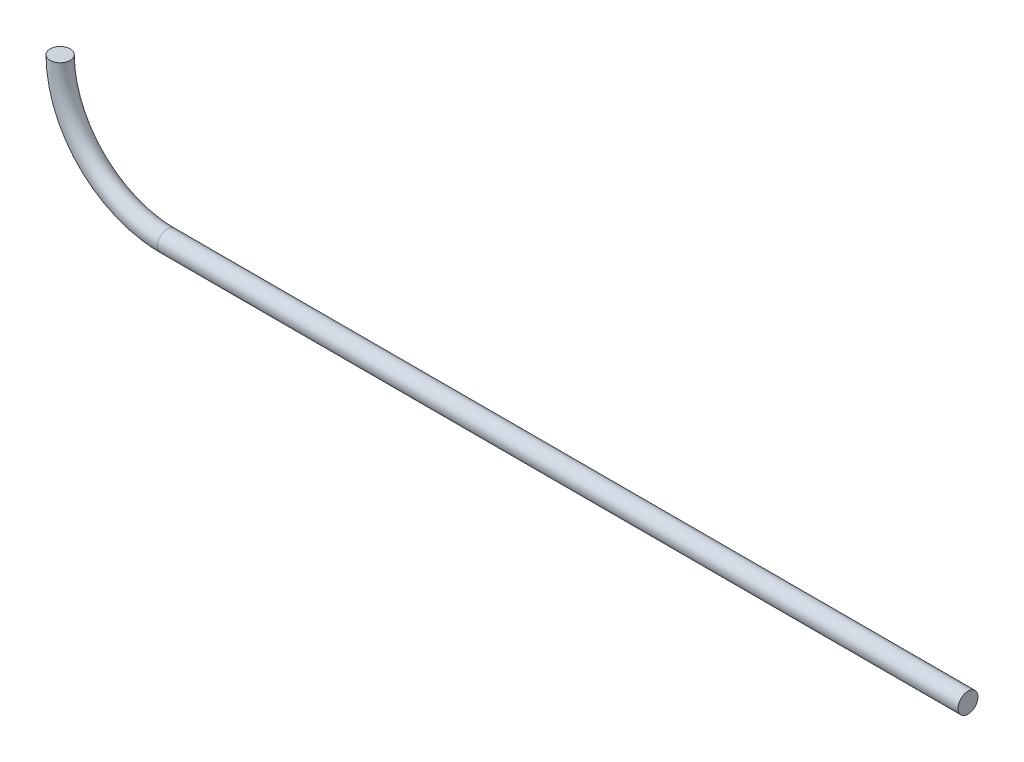
ISO-10303-21;
HEADER;
FILE_DESCRIPTION(('STEP AP214'),'2;1');
FILE_NAME('part.step','',(''),(''),'','','');
FILE_SCHEMA(('AUTOMOTIVE_DESIGN { 1 0 10303 214 1 1 1 1 }'));
ENDSEC;
DATA;
#1=APPLICATION_CONTEXT('core data for automotive mechanical design processes');
#2=APPLICATION_PROTOCOL_DEFINITION('international standard','automotive_design',2000,#1);
#3=PRODUCT_CONTEXT('',#1,'mechanical');
#4=PRODUCT('Part','Part','',(#3));
#5=PRODUCT_RELATED_PRODUCT_CATEGORY('part','',(#4));
#6=PRODUCT_DEFINITION_FORMATION('','',#4);
#7=PRODUCT_DEFINITION_CONTEXT('part definition',#1,'design');
#8=PRODUCT_DEFINITION('design','',#6,#7);
#9=PRODUCT_DEFINITION_SHAPE('','',#8);
#10=(LENGTH_UNIT() NAMED_UNIT(*) SI_UNIT(.MILLI.,.METRE.));
#11=(NAMED_UNIT(*) PLANE_ANGLE_UNIT() SI_UNIT($,.RADIAN.));
#12=(NAMED_UNIT(*) SI_UNIT($,.STERADIAN.) SOLID_ANGLE_UNIT());
#13=UNCERTAINTY_MEASURE_WITH_UNIT(LENGTH_MEASURE(1.E-05),#10,'distance_accuracy_value','');
#14=(GEOMETRIC_REPRESENTATION_CONTEXT(3) GLOBAL_UNCERTAINTY_ASSIGNED_CONTEXT((#13)) GLOBAL_UNIT_ASSIGNED_CONTEXT((#10,
#11,#12)) REPRESENTATION_CONTEXT('',''));
#15=CARTESIAN_POINT('',(0.,0.,0.));
#16=DIRECTION('',(0.,0.,1.));
#17=DIRECTION('',(1.,0.,0.));
#18=AXIS2_PLACEMENT_3D('',#15,#16,#17);
#19=CARTESIAN_POINT('',(-5.36,0.,0.));
#20=DIRECTION('',(0.,1.,0.));
#21=DIRECTION('',(0.,0.,1.));
#22=AXIS2_PLACEMENT_3D('',#19,#20,#21);
#23=PLANE('',#22);
#24=CARTESIAN_POINT('',(-5.36,0.,0.));
#25=DIRECTION('',(0.,1.,0.));
#26=DIRECTION('',(0.,0.,1.));
#27=AXIS2_PLACEMENT_3D('',#24,#25,#26);
#28=CIRCLE('',#27,0.500000000000001);
#29=CARTESIAN_POINT('',(-5.36,0.,0.500000000000001));
#30=VERTEX_POINT('',#29);
#31=EDGE_CURVE('E48',#30,#30,#28,.T.);
#32=ORIENTED_EDGE('',*,*,#31,.T.);
#33=EDGE_LOOP('',(#32));
#34=FACE_BOUND('',#33,.T.);
#35=ADVANCED_FACE('F36',(#34),#23,.T.);
#36=CARTESIAN_POINT('',(40.,-5.36,0.));
#37=DIRECTION('',(-1.,0.,0.));
#38=DIRECTION('',(0.,0.,1.));
#39=AXIS2_PLACEMENT_3D('',#36,#37,#38);
#40=PLANE('',#39);
#41=CARTESIAN_POINT('',(40.,-5.36,0.));
#42=DIRECTION('',(-1.,0.,0.));
#43=DIRECTION('',(0.,0.,1.));
#44=AXIS2_PLACEMENT_3D('',#41,#42,#43);
#45=CIRCLE('',#44,0.500000000000001);
#46=CARTESIAN_POINT('',(40.,-5.36,0.500000000000001));
#47=VERTEX_POINT('',#46);
#48=EDGE_CURVE('E11',#47,#47,#45,.T.);
#49=ORIENTED_EDGE('',*,*,#48,.F.);
#50=EDGE_LOOP('',(#49));
#51=FACE_BOUND('',#50,.T.);
#52=ADVANCED_FACE('F54',(#51),#40,.F.);
#53=CARTESIAN_POINT('',(0.,0.,0.));
#54=DIRECTION('',(0.,0.,1.));
#55=DIRECTION('',(1.,0.,0.));
#56=AXIS2_PLACEMENT_3D('',#53,#54,#55);
#57=TOROIDAL_SURFACE('',#56,5.36,0.500000000000001);
#58=CARTESIAN_POINT('',(0.,-5.36,0.));
#59=DIRECTION('',(-1.,0.,0.));
#60=DIRECTION('',(0.,0.,1.));
#61=AXIS2_PLACEMENT_3D('',#58,#59,#60);
#62=CIRCLE('',#61,0.500000000000001);
#63=CARTESIAN_POINT('',(0.,-5.36,0.500000000000001));
#64=VERTEX_POINT('',#63);
#65=EDGE_CURVE('E43',#64,#64,#62,.T.);
#66=ORIENTED_EDGE('',*,*,#65,.T.);
#67=EDGE_LOOP('',(#66));
#68=FACE_BOUND('',#67,.T.);
#69=ORIENTED_EDGE('',*,*,#31,.F.);
#70=EDGE_LOOP('',(#69));
#71=FACE_BOUND('',#70,.T.);
#72=ADVANCED_FACE('F56',(#68,#71),#57,.T.);
#73=CARTESIAN_POINT('',(0.,-5.36,0.));
#74=DIRECTION('',(1.,0.,0.));
#75=DIRECTION('',(0.,0.,-1.));
#76=AXIS2_PLACEMENT_3D('',#73,#74,#75);
#77=CYLINDRICAL_SURFACE('',#76,0.500000000000001);
#78=ORIENTED_EDGE('',*,*,#48,.T.);
#79=EDGE_LOOP('',(#78));
#80=FACE_BOUND('',#79,.T.);
#81=ORIENTED_EDGE('',*,*,#65,.F.);
#82=EDGE_LOOP('',(#81));
#83=FACE_BOUND('',#82,.T.);
#84=ADVANCED_FACE('F51',(#80,#83),#77,.T.);
#85=CLOSED_SHELL('',(#35,#52,#72,#84));
#86=MANIFOLD_SOLID_BREP('B2',#85);
#87=ADVANCED_BREP_SHAPE_REPRESENTATION('',(#18,#86),#14);
#88=SHAPE_DEFINITION_REPRESENTATION(#9,#87);
ENDSEC;
END-ISO-10303-21;
